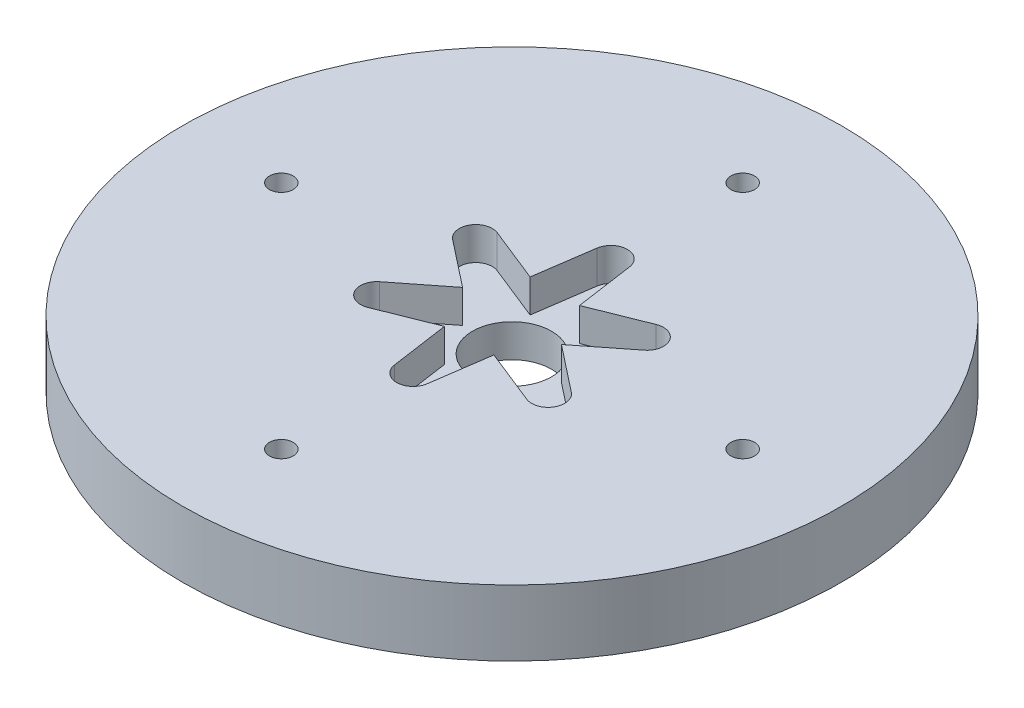
ISO-10303-21;
HEADER;
FILE_DESCRIPTION(('STEP AP214'),'2;1');
FILE_NAME('part.step','',(''),(''),'','','');
FILE_SCHEMA(('AUTOMOTIVE_DESIGN { 1 0 10303 214 1 1 1 1 }'));
ENDSEC;
DATA;
#1=APPLICATION_CONTEXT('core data for automotive mechanical design processes');
#2=APPLICATION_PROTOCOL_DEFINITION('international standard','automotive_design',2000,#1);
#3=PRODUCT_CONTEXT('',#1,'mechanical');
#4=PRODUCT('Part','Part','',(#3));
#5=PRODUCT_RELATED_PRODUCT_CATEGORY('part','',(#4));
#6=PRODUCT_DEFINITION_FORMATION('','',#4);
#7=PRODUCT_DEFINITION_CONTEXT('part definition',#1,'design');
#8=PRODUCT_DEFINITION('design','',#6,#7);
#9=PRODUCT_DEFINITION_SHAPE('','',#8);
#10=(LENGTH_UNIT() NAMED_UNIT(*) SI_UNIT(.MILLI.,.METRE.));
#11=(NAMED_UNIT(*) PLANE_ANGLE_UNIT() SI_UNIT($,.RADIAN.));
#12=(NAMED_UNIT(*) SI_UNIT($,.STERADIAN.) SOLID_ANGLE_UNIT());
#13=UNCERTAINTY_MEASURE_WITH_UNIT(LENGTH_MEASURE(1.E-05),#10,'distance_accuracy_value','');
#14=(GEOMETRIC_REPRESENTATION_CONTEXT(3) GLOBAL_UNCERTAINTY_ASSIGNED_CONTEXT((#13)) GLOBAL_UNIT_ASSIGNED_CONTEXT((#10,
#11,#12)) REPRESENTATION_CONTEXT('',''));
#15=CARTESIAN_POINT('',(0.,0.,0.));
#16=DIRECTION('',(0.,0.,1.));
#17=DIRECTION('',(1.,0.,0.));
#18=AXIS2_PLACEMENT_3D('',#15,#16,#17);
#19=CARTESIAN_POINT('',(0.,5.,0.));
#20=DIRECTION('',(0.,1.,0.));
#21=DIRECTION('',(0.,0.,1.));
#22=AXIS2_PLACEMENT_3D('',#19,#20,#21);
#23=PLANE('',#22);
#24=CARTESIAN_POINT('',(0.,5.,35.));
#25=DIRECTION('',(0.,1.,0.));
#26=DIRECTION('',(0.,0.,1.));
#27=AXIS2_PLACEMENT_3D('',#24,#25,#26);
#28=CIRCLE('',#27,1.8);
#29=CARTESIAN_POINT('',(0.,5.,36.8));
#30=VERTEX_POINT('',#29);
#31=EDGE_CURVE('E497',#30,#30,#28,.T.);
#32=ORIENTED_EDGE('',*,*,#31,.F.);
#33=EDGE_LOOP('',(#32));
#34=FACE_BOUND('',#33,.T.);
#35=CARTESIAN_POINT('',(0.,5.,-35.));
#36=DIRECTION('',(0.,1.,0.));
#37=DIRECTION('',(0.,0.,1.));
#38=AXIS2_PLACEMENT_3D('',#35,#36,#37);
#39=CIRCLE('',#38,1.8);
#40=CARTESIAN_POINT('',(0.,5.,-33.2));
#41=VERTEX_POINT('',#40);
#42=EDGE_CURVE('E240',#41,#41,#39,.T.);
#43=ORIENTED_EDGE('',*,*,#42,.F.);
#44=EDGE_LOOP('',(#43));
#45=FACE_BOUND('',#44,.T.);
#46=CARTESIAN_POINT('',(0.,5.,0.));
#47=DIRECTION('',(0.,1.,0.));
#48=DIRECTION('',(0.,0.,1.));
#49=AXIS2_PLACEMENT_3D('',#46,#47,#48);
#50=CIRCLE('',#49,50.);
#51=CARTESIAN_POINT('',(0.,5.,50.));
#52=VERTEX_POINT('',#51);
#53=EDGE_CURVE('E11',#52,#52,#50,.T.);
#54=ORIENTED_EDGE('',*,*,#53,.T.);
#55=EDGE_LOOP('',(#54));
#56=FACE_BOUND('',#55,.T.);
#57=DIRECTION('',(-0.928457391309651,0.,-0.371438921658026));
#58=VECTOR('',#57,1.);
#59=CARTESIAN_POINT('',(-12.0617837526215,5.,-9.82114347827412));
#60=LINE('',#59,#58);
#61=CARTESIAN_POINT('',(-3.75416512459886,5.,-6.49759526419164));
#62=VERTEX_POINT('',#61);
#63=CARTESIAN_POINT('',(-12.0617837526215,5.,-9.82114347827412));
#64=VERTEX_POINT('',#63);
#65=EDGE_CURVE('E352',#62,#64,#60,.T.);
#66=ORIENTED_EDGE('',*,*,#65,.F.);
#67=DIRECTION('',(-0.866025403784428,0.,0.500000000000019));
#68=VECTOR('',#67,1.);
#69=CARTESIAN_POINT('',(-3.75,5.,-6.5));
#70=LINE('',#69,#68);
#71=CARTESIAN_POINT('',(-3.75,5.,-6.5));
#72=VERTEX_POINT('',#71);
#73=EDGE_CURVE('E142',#72,#62,#70,.T.);
#74=ORIENTED_EDGE('',*,*,#73,.F.);
#75=DIRECTION('',(-0.142553153544677,0.,0.9897871480346));
#76=VECTOR('',#75,1.);
#77=CARTESIAN_POINT('',(-3.75,5.,-6.5));
#78=LINE('',#77,#76);
#79=CARTESIAN_POINT('',(-2.4744678700865,5.,-15.3563828838617));
#80=VERTEX_POINT('',#79);
#81=EDGE_CURVE('E59',#80,#72,#78,.T.);
#82=ORIENTED_EDGE('',*,*,#81,.F.);
#83=CARTESIAN_POINT('',(0.,5.,-15.));
#84=DIRECTION('',(0.,1.,0.));
#85=DIRECTION('',(0.,0.,1.));
#86=AXIS2_PLACEMENT_3D('',#83,#84,#85);
#87=CIRCLE('',#86,2.5);
#88=CARTESIAN_POINT('',(2.4744678700865,5.,-15.3563828838617));
#89=VERTEX_POINT('',#88);
#90=EDGE_CURVE('E229',#89,#80,#87,.T.);
#91=ORIENTED_EDGE('',*,*,#90,.F.);
#92=DIRECTION('',(-0.142553153544677,0.,-0.9897871480346));
#93=VECTOR('',#92,1.);
#94=CARTESIAN_POINT('',(2.4744678700865,5.,-15.3563828838617));
#95=LINE('',#94,#93);
#96=CARTESIAN_POINT('',(3.75,5.,-6.5));
#97=VERTEX_POINT('',#96);
#98=EDGE_CURVE('E215',#97,#89,#95,.T.);
#99=ORIENTED_EDGE('',*,*,#98,.F.);
#100=DIRECTION('',(-0.866025403784379,0.,-0.500000000000103));
#101=VECTOR('',#100,1.);
#102=CARTESIAN_POINT('',(3.75,5.,-6.5));
#103=LINE('',#102,#101);
#104=CARTESIAN_POINT('',(3.75416512459885,5.,-6.49759526419164));
#105=VERTEX_POINT('',#104);
#106=EDGE_CURVE('E205',#105,#97,#103,.T.);
#107=ORIENTED_EDGE('',*,*,#106,.F.);
#108=DIRECTION('',(-0.928457391309651,0.,0.371438921658027));
#109=VECTOR('',#108,1.);
#110=CARTESIAN_POINT('',(3.75416512459885,5.,-6.49759526419164));
#111=LINE('',#110,#109);
#112=CARTESIAN_POINT('',(12.0617837526215,5.,-9.82114347827413));
#113=VERTEX_POINT('',#112);
#114=EDGE_CURVE('E216',#113,#105,#111,.T.);
#115=ORIENTED_EDGE('',*,*,#114,.F.);
#116=CARTESIAN_POINT('',(12.9903810567666,5.,-7.50000000000001));
#117=DIRECTION('',(0.,1.,0.));
#118=DIRECTION('',(0.,0.,1.));
#119=AXIS2_PLACEMENT_3D('',#116,#117,#118);
#120=CIRCLE('',#119,2.5);
#121=CARTESIAN_POINT('',(14.536251622708,5.,-5.53523940558757));
#122=VERTEX_POINT('',#121);
#123=EDGE_CURVE('E390',#122,#113,#120,.T.);
#124=ORIENTED_EDGE('',*,*,#123,.F.);
#125=DIRECTION('',(0.785904237764974,0.,-0.618348226376574));
#126=VECTOR('',#125,1.);
#127=CARTESIAN_POINT('',(14.536251622708,5.,-5.53523940558757));
#128=LINE('',#127,#126);
#129=CARTESIAN_POINT('',(7.50416512459885,5.,-0.00240473580835621));
#130=VERTEX_POINT('',#129);
#131=EDGE_CURVE('E388',#130,#122,#128,.T.);
#132=ORIENTED_EDGE('',*,*,#131,.F.);
#133=DIRECTION('',(0.,0.,-1.));
#134=VECTOR('',#133,1.);
#135=CARTESIAN_POINT('',(7.50416512459885,5.,-0.00240473580835621));
#136=LINE('',#135,#134);
#137=CARTESIAN_POINT('',(7.50416512459885,5.,0.00240473580835274));
#138=VERTEX_POINT('',#137);
#139=EDGE_CURVE('E386',#138,#130,#136,.T.);
#140=ORIENTED_EDGE('',*,*,#139,.F.);
#141=DIRECTION('',(-0.785904237764975,0.,-0.618348226376574));
#142=VECTOR('',#141,1.);
#143=CARTESIAN_POINT('',(7.50416512459885,5.,0.00240473580835274));
#144=LINE('',#143,#142);
#145=CARTESIAN_POINT('',(14.536251622708,5.,5.53523940558756));
#146=VERTEX_POINT('',#145);
#147=EDGE_CURVE('E384',#146,#138,#144,.T.);
#148=ORIENTED_EDGE('',*,*,#147,.F.);
#149=CARTESIAN_POINT('',(12.9903810567666,5.,7.5));
#150=DIRECTION('',(0.,1.,0.));
#151=DIRECTION('',(0.,0.,1.));
#152=AXIS2_PLACEMENT_3D('',#149,#150,#151);
#153=CIRCLE('',#152,2.5);
#154=CARTESIAN_POINT('',(12.0617837526215,5.,9.82114347827412));
#155=VERTEX_POINT('',#154);
#156=EDGE_CURVE('E382',#155,#146,#153,.T.);
#157=ORIENTED_EDGE('',*,*,#156,.F.);
#158=DIRECTION('',(0.928457391309651,0.,0.371438921658026));
#159=VECTOR('',#158,1.);
#160=CARTESIAN_POINT('',(12.0617837526215,5.,9.82114347827412));
#161=LINE('',#160,#159);
#162=CARTESIAN_POINT('',(3.75416512459885,5.,6.49759526419164));
#163=VERTEX_POINT('',#162);
#164=EDGE_CURVE('E380',#163,#155,#161,.T.);
#165=ORIENTED_EDGE('',*,*,#164,.F.);
#166=DIRECTION('',(0.866025403784515,0.,-0.499999999999868));
#167=VECTOR('',#166,1.);
#168=CARTESIAN_POINT('',(3.75416512459885,5.,6.49759526419164));
#169=LINE('',#168,#167);
#170=CARTESIAN_POINT('',(3.75,5.,6.5));
#171=VERTEX_POINT('',#170);
#172=EDGE_CURVE('E378',#171,#163,#169,.T.);
#173=ORIENTED_EDGE('',*,*,#172,.F.);
#174=DIRECTION('',(0.142553153544677,0.,-0.9897871480346));
#175=VECTOR('',#174,1.);
#176=CARTESIAN_POINT('',(3.75,5.,6.5));
#177=LINE('',#176,#175);
#178=CARTESIAN_POINT('',(2.4744678700865,5.,15.3563828838617));
#179=VERTEX_POINT('',#178);
#180=EDGE_CURVE('E376',#179,#171,#177,.T.);
#181=ORIENTED_EDGE('',*,*,#180,.F.);
#182=CARTESIAN_POINT('',(0.,5.,15.));
#183=DIRECTION('',(0.,1.,0.));
#184=DIRECTION('',(0.,0.,1.));
#185=AXIS2_PLACEMENT_3D('',#182,#183,#184);
#186=CIRCLE('',#185,2.5);
#187=CARTESIAN_POINT('',(-2.4744678700865,5.,15.3563828838617));
#188=VERTEX_POINT('',#187);
#189=EDGE_CURVE('E374',#188,#179,#186,.T.);
#190=ORIENTED_EDGE('',*,*,#189,.F.);
#191=DIRECTION('',(0.142553153544677,0.,0.9897871480346));
#192=VECTOR('',#191,1.);
#193=CARTESIAN_POINT('',(-2.4744678700865,5.,15.3563828838617));
#194=LINE('',#193,#192);
#195=CARTESIAN_POINT('',(-3.75,5.,6.5));
#196=VERTEX_POINT('',#195);
#197=EDGE_CURVE('E372',#196,#188,#194,.T.);
#198=ORIENTED_EDGE('',*,*,#197,.F.);
#199=DIRECTION('',(0.86602540378449,0.,0.49999999999991));
#200=VECTOR('',#199,1.);
#201=CARTESIAN_POINT('',(-3.75,5.,6.5));
#202=LINE('',#201,#200);
#203=CARTESIAN_POINT('',(-3.75416512459885,5.,6.49759526419165));
#204=VERTEX_POINT('',#203);
#205=EDGE_CURVE('E370',#204,#196,#202,.T.);
#206=ORIENTED_EDGE('',*,*,#205,.F.);
#207=DIRECTION('',(0.928457391309651,0.,-0.371438921658027));
#208=VECTOR('',#207,1.);
#209=CARTESIAN_POINT('',(-3.75416512459885,5.,6.49759526419165));
#210=LINE('',#209,#208);
#211=CARTESIAN_POINT('',(-12.0617837526215,5.,9.82114347827413));
#212=VERTEX_POINT('',#211);
#213=EDGE_CURVE('E368',#212,#204,#210,.T.);
#214=ORIENTED_EDGE('',*,*,#213,.F.);
#215=CARTESIAN_POINT('',(-12.9903810567666,5.,7.50000000000001));
#216=DIRECTION('',(0.,1.,0.));
#217=DIRECTION('',(0.,0.,1.));
#218=AXIS2_PLACEMENT_3D('',#215,#216,#217);
#219=CIRCLE('',#218,2.5);
#220=CARTESIAN_POINT('',(-14.536251622708,5.,5.53523940558757));
#221=VERTEX_POINT('',#220);
#222=EDGE_CURVE('E366',#221,#212,#219,.T.);
#223=ORIENTED_EDGE('',*,*,#222,.F.);
#224=DIRECTION('',(-0.785904237764974,0.,0.618348226376574));
#225=VECTOR('',#224,1.);
#226=CARTESIAN_POINT('',(-14.536251622708,5.,5.53523940558757));
#227=LINE('',#226,#225);
#228=CARTESIAN_POINT('',(-7.50416512459885,5.,0.00240473580835794));
#229=VERTEX_POINT('',#228);
#230=EDGE_CURVE('E364',#229,#221,#227,.T.);
#231=ORIENTED_EDGE('',*,*,#230,.F.);
#232=DIRECTION('',(0.,0.,1.));
#233=VECTOR('',#232,1.);
#234=CARTESIAN_POINT('',(-7.50416512459885,5.,-0.00240473580834927));
#235=LINE('',#234,#233);
#236=CARTESIAN_POINT('',(-7.50416512459885,5.,-0.00240473580834927));
#237=VERTEX_POINT('',#236);
#238=EDGE_CURVE('E362',#237,#229,#235,.T.);
#239=ORIENTED_EDGE('',*,*,#238,.F.);
#240=DIRECTION('',(0.785904237764975,0.,0.618348226376573));
#241=VECTOR('',#240,1.);
#242=CARTESIAN_POINT('',(-7.50416512459885,5.,-0.00240473580834927));
#243=LINE('',#242,#241);
#244=CARTESIAN_POINT('',(-14.536251622708,5.,-5.53523940558755));
#245=VERTEX_POINT('',#244);
#246=EDGE_CURVE('E360',#245,#237,#243,.T.);
#247=ORIENTED_EDGE('',*,*,#246,.F.);
#248=CARTESIAN_POINT('',(-12.9903810567666,5.,-7.49999999999999));
#249=DIRECTION('',(0.,1.,0.));
#250=DIRECTION('',(0.,0.,1.));
#251=AXIS2_PLACEMENT_3D('',#248,#249,#250);
#252=CIRCLE('',#251,2.5);
#253=EDGE_CURVE('E354',#64,#245,#252,.T.);
#254=ORIENTED_EDGE('',*,*,#253,.F.);
#255=EDGE_LOOP('',(#66,#74,#82,#91,#99,#107,#115,#124,#132,#140,#148,#157,#165,#173,#181,#190,
#198,#206,#214,#223,#231,#239,#247,#254));
#256=FACE_BOUND('',#255,.T.);
#257=CARTESIAN_POINT('',(35.,5.,0.));
#258=DIRECTION('',(0.,1.,0.));
#259=DIRECTION('',(0.,0.,1.));
#260=AXIS2_PLACEMENT_3D('',#257,#258,#259);
#261=CIRCLE('',#260,1.79999999999999);
#262=CARTESIAN_POINT('',(35.,5.,1.79999999999999));
#263=VERTEX_POINT('',#262);
#264=EDGE_CURVE('E517',#263,#263,#261,.T.);
#265=ORIENTED_EDGE('',*,*,#264,.F.);
#266=EDGE_LOOP('',(#265));
#267=FACE_BOUND('',#266,.T.);
#268=CARTESIAN_POINT('',(-35.,5.,0.));
#269=DIRECTION('',(0.,1.,0.));
#270=DIRECTION('',(0.,0.,1.));
#271=AXIS2_PLACEMENT_3D('',#268,#269,#270);
#272=CIRCLE('',#271,1.8);
#273=CARTESIAN_POINT('',(-35.,5.,1.80000000000001));
#274=VERTEX_POINT('',#273);
#275=EDGE_CURVE('E507',#274,#274,#272,.T.);
#276=ORIENTED_EDGE('',*,*,#275,.F.);
#277=EDGE_LOOP('',(#276));
#278=FACE_BOUND('',#277,.T.);
#279=ADVANCED_FACE('F38',(#34,#45,#56,#256,#267,#278),#23,.T.);
#280=CARTESIAN_POINT('',(0.,5.,0.));
#281=DIRECTION('',(0.,-1.,0.));
#282=DIRECTION('',(0.,0.,-1.));
#283=AXIS2_PLACEMENT_3D('',#280,#281,#282);
#284=CYLINDRICAL_SURFACE('',#283,50.);
#285=ORIENTED_EDGE('',*,*,#53,.F.);
#286=EDGE_LOOP('',(#285));
#287=FACE_BOUND('',#286,.T.);
#288=CARTESIAN_POINT('',(0.,-5.,0.));
#289=DIRECTION('',(0.,-1.,0.));
#290=DIRECTION('',(0.,0.,-1.));
#291=AXIS2_PLACEMENT_3D('',#288,#289,#290);
#292=CIRCLE('',#291,50.);
#293=CARTESIAN_POINT('',(0.,-5.,-50.));
#294=VERTEX_POINT('',#293);
#295=EDGE_CURVE('E505',#294,#294,#292,.T.);
#296=ORIENTED_EDGE('',*,*,#295,.F.);
#297=EDGE_LOOP('',(#296));
#298=FACE_BOUND('',#297,.T.);
#299=ADVANCED_FACE('F40',(#287,#298),#284,.T.);
#300=CARTESIAN_POINT('',(-3.75,5.,-6.5));
#301=DIRECTION('',(0.500000000000019,0.,0.866025403784428));
#302=DIRECTION('',(0.866025403784428,0.,-0.500000000000019));
#303=AXIS2_PLACEMENT_3D('',#300,#301,#302);
#304=PLANE('',#303);
#305=DIRECTION('',(-0.866025403784428,0.,0.500000000000019));
#306=VECTOR('',#305,1.);
#307=CARTESIAN_POINT('',(-3.75,0.,-6.5));
#308=LINE('',#307,#306);
#309=CARTESIAN_POINT('',(-3.75,0.,-6.5));
#310=VERTEX_POINT('',#309);
#311=CARTESIAN_POINT('',(-3.75416512459886,0.,-6.49759526419164));
#312=VERTEX_POINT('',#311);
#313=EDGE_CURVE('E236',#310,#312,#308,.T.);
#314=ORIENTED_EDGE('',*,*,#313,.F.);
#315=DIRECTION('',(0.,-1.,0.));
#316=VECTOR('',#315,1.);
#317=CARTESIAN_POINT('',(-3.75,5.,-6.5));
#318=LINE('',#317,#316);
#319=EDGE_CURVE('E235',#72,#310,#318,.T.);
#320=ORIENTED_EDGE('',*,*,#319,.F.);
#321=ORIENTED_EDGE('',*,*,#73,.T.);
#322=DIRECTION('',(0.,-1.,0.));
#323=VECTOR('',#322,1.);
#324=CARTESIAN_POINT('',(-3.75416512459886,5.,-6.49759526419164));
#325=LINE('',#324,#323);
#326=EDGE_CURVE('E46',#62,#312,#325,.T.);
#327=ORIENTED_EDGE('',*,*,#326,.T.);
#328=EDGE_LOOP('',(#314,#320,#321,#327));
#329=FACE_BOUND('',#328,.T.);
#330=ADVANCED_FACE('F346',(#329),#304,.T.);
#331=CARTESIAN_POINT('',(-12.0617837526215,5.,-9.82114347827412));
#332=DIRECTION('',(-0.371438921658026,0.,0.928457391309651));
#333=DIRECTION('',(0.928457391309651,0.,0.371438921658026));
#334=AXIS2_PLACEMENT_3D('',#331,#332,#333);
#335=PLANE('',#334);
#336=DIRECTION('',(-0.928457391309651,0.,-0.371438921658026));
#337=VECTOR('',#336,1.);
#338=CARTESIAN_POINT('',(-12.0617837526215,0.,-9.82114347827412));
#339=LINE('',#338,#337);
#340=CARTESIAN_POINT('',(-12.0617837526215,0.,-9.82114347827412));
#341=VERTEX_POINT('',#340);
#342=EDGE_CURVE('E239',#312,#341,#339,.T.);
#343=ORIENTED_EDGE('',*,*,#342,.F.);
#344=ORIENTED_EDGE('',*,*,#326,.F.);
#345=ORIENTED_EDGE('',*,*,#65,.T.);
#346=DIRECTION('',(0.,-1.,0.));
#347=VECTOR('',#346,1.);
#348=CARTESIAN_POINT('',(-12.0617837526215,5.,-9.82114347827412));
#349=LINE('',#348,#347);
#350=EDGE_CURVE('E344',#64,#341,#349,.T.);
#351=ORIENTED_EDGE('',*,*,#350,.T.);
#352=EDGE_LOOP('',(#343,#344,#345,#351));
#353=FACE_BOUND('',#352,.T.);
#354=ADVANCED_FACE('F479',(#353),#335,.T.);
#355=CARTESIAN_POINT('',(-12.9903810567666,5.,-7.49999999999999));
#356=DIRECTION('',(0.,-1.,0.));
#357=DIRECTION('',(0.,0.,-1.));
#358=AXIS2_PLACEMENT_3D('',#355,#356,#357);
#359=CYLINDRICAL_SURFACE('',#358,2.5);
#360=CARTESIAN_POINT('',(-12.9903810567666,0.,-7.49999999999999));
#361=DIRECTION('',(0.,1.,0.));
#362=DIRECTION('',(0.,0.,1.));
#363=AXIS2_PLACEMENT_3D('',#360,#361,#362);
#364=CIRCLE('',#363,2.5);
#365=CARTESIAN_POINT('',(-14.536251622708,0.,-5.53523940558755));
#366=VERTEX_POINT('',#365);
#367=EDGE_CURVE('E243',#341,#366,#364,.T.);
#368=ORIENTED_EDGE('',*,*,#367,.F.);
#369=ORIENTED_EDGE('',*,*,#350,.F.);
#370=ORIENTED_EDGE('',*,*,#253,.T.);
#371=DIRECTION('',(0.,-1.,0.));
#372=VECTOR('',#371,1.);
#373=CARTESIAN_POINT('',(-14.536251622708,5.,-5.53523940558755));
#374=LINE('',#373,#372);
#375=EDGE_CURVE('E342',#245,#366,#374,.T.);
#376=ORIENTED_EDGE('',*,*,#375,.T.);
#377=EDGE_LOOP('',(#368,#369,#370,#376));
#378=FACE_BOUND('',#377,.T.);
#379=ADVANCED_FACE('F477',(#378),#359,.F.);
#380=CARTESIAN_POINT('',(-7.50416512459885,5.,-0.00240473580834927));
#381=DIRECTION('',(0.618348226376573,0.,-0.785904237764975));
#382=DIRECTION('',(-0.785904237764975,0.,-0.618348226376573));
#383=AXIS2_PLACEMENT_3D('',#380,#381,#382);
#384=PLANE('',#383);
#385=DIRECTION('',(0.785904237764975,0.,0.618348226376573));
#386=VECTOR('',#385,1.);
#387=CARTESIAN_POINT('',(-7.50416512459885,0.,-0.00240473580834927));
#388=LINE('',#387,#386);
#389=CARTESIAN_POINT('',(-7.50416512459885,0.,-0.00240473580834927));
#390=VERTEX_POINT('',#389);
#391=EDGE_CURVE('E246',#366,#390,#388,.T.);
#392=ORIENTED_EDGE('',*,*,#391,.F.);
#393=ORIENTED_EDGE('',*,*,#375,.F.);
#394=ORIENTED_EDGE('',*,*,#246,.T.);
#395=DIRECTION('',(0.,-1.,0.));
#396=VECTOR('',#395,1.);
#397=CARTESIAN_POINT('',(-7.50416512459885,5.,-0.00240473580834927));
#398=LINE('',#397,#396);
#399=EDGE_CURVE('E340',#237,#390,#398,.T.);
#400=ORIENTED_EDGE('',*,*,#399,.T.);
#401=EDGE_LOOP('',(#392,#393,#394,#400));
#402=FACE_BOUND('',#401,.T.);
#403=ADVANCED_FACE('F474',(#402),#384,.T.);
#404=CARTESIAN_POINT('',(-7.50416512459885,5.,-0.00240473580834927));
#405=DIRECTION('',(1.,0.,0.));
#406=DIRECTION('',(0.,0.,-1.));
#407=AXIS2_PLACEMENT_3D('',#404,#405,#406);
#408=PLANE('',#407);
#409=DIRECTION('',(0.,0.,1.));
#410=VECTOR('',#409,1.);
#411=CARTESIAN_POINT('',(-7.50416512459885,0.,-0.00240473580834927));
#412=LINE('',#411,#410);
#413=CARTESIAN_POINT('',(-7.50416512459885,0.,0.00240473580835794));
#414=VERTEX_POINT('',#413);
#415=EDGE_CURVE('E249',#390,#414,#412,.T.);
#416=ORIENTED_EDGE('',*,*,#415,.F.);
#417=ORIENTED_EDGE('',*,*,#399,.F.);
#418=ORIENTED_EDGE('',*,*,#238,.T.);
#419=DIRECTION('',(0.,-1.,0.));
#420=VECTOR('',#419,1.);
#421=CARTESIAN_POINT('',(-7.50416512459885,5.,0.00240473580835794));
#422=LINE('',#421,#420);
#423=EDGE_CURVE('E338',#229,#414,#422,.T.);
#424=ORIENTED_EDGE('',*,*,#423,.T.);
#425=EDGE_LOOP('',(#416,#417,#418,#424));
#426=FACE_BOUND('',#425,.T.);
#427=ADVANCED_FACE('F468',(#426),#408,.T.);
#428=CARTESIAN_POINT('',(-14.536251622708,5.,5.53523940558757));
#429=DIRECTION('',(0.618348226376574,0.,0.785904237764974));
#430=DIRECTION('',(0.785904237764974,0.,-0.618348226376574));
#431=AXIS2_PLACEMENT_3D('',#428,#429,#430);
#432=PLANE('',#431);
#433=DIRECTION('',(-0.785904237764974,0.,0.618348226376574));
#434=VECTOR('',#433,1.);
#435=CARTESIAN_POINT('',(-14.536251622708,0.,5.53523940558757));
#436=LINE('',#435,#434);
#437=CARTESIAN_POINT('',(-14.536251622708,0.,5.53523940558757));
#438=VERTEX_POINT('',#437);
#439=EDGE_CURVE('E252',#414,#438,#436,.T.);
#440=ORIENTED_EDGE('',*,*,#439,.F.);
#441=ORIENTED_EDGE('',*,*,#423,.F.);
#442=ORIENTED_EDGE('',*,*,#230,.T.);
#443=DIRECTION('',(0.,-1.,0.));
#444=VECTOR('',#443,1.);
#445=CARTESIAN_POINT('',(-14.536251622708,5.,5.53523940558757));
#446=LINE('',#445,#444);
#447=EDGE_CURVE('E336',#221,#438,#446,.T.);
#448=ORIENTED_EDGE('',*,*,#447,.T.);
#449=EDGE_LOOP('',(#440,#441,#442,#448));
#450=FACE_BOUND('',#449,.T.);
#451=ADVANCED_FACE('F464',(#450),#432,.T.);
#452=CARTESIAN_POINT('',(-12.9903810567666,5.,7.50000000000001));
#453=DIRECTION('',(0.,-1.,0.));
#454=DIRECTION('',(0.,0.,-1.));
#455=AXIS2_PLACEMENT_3D('',#452,#453,#454);
#456=CYLINDRICAL_SURFACE('',#455,2.5);
#457=CARTESIAN_POINT('',(-12.9903810567666,0.,7.50000000000001));
#458=DIRECTION('',(0.,1.,0.));
#459=DIRECTION('',(0.,0.,1.));
#460=AXIS2_PLACEMENT_3D('',#457,#458,#459);
#461=CIRCLE('',#460,2.5);
#462=CARTESIAN_POINT('',(-12.0617837526215,0.,9.82114347827413));
#463=VERTEX_POINT('',#462);
#464=EDGE_CURVE('E255',#438,#463,#461,.T.);
#465=ORIENTED_EDGE('',*,*,#464,.F.);
#466=ORIENTED_EDGE('',*,*,#447,.F.);
#467=ORIENTED_EDGE('',*,*,#222,.T.);
#468=DIRECTION('',(0.,-1.,0.));
#469=VECTOR('',#468,1.);
#470=CARTESIAN_POINT('',(-12.0617837526215,5.,9.82114347827413));
#471=LINE('',#470,#469);
#472=EDGE_CURVE('E334',#212,#463,#471,.T.);
#473=ORIENTED_EDGE('',*,*,#472,.T.);
#474=EDGE_LOOP('',(#465,#466,#467,#473));
#475=FACE_BOUND('',#474,.T.);
#476=ADVANCED_FACE('F461',(#475),#456,.F.);
#477=CARTESIAN_POINT('',(-3.75416512459885,5.,6.49759526419165));
#478=DIRECTION('',(-0.371438921658027,0.,-0.928457391309651));
#479=DIRECTION('',(-0.928457391309651,0.,0.371438921658027));
#480=AXIS2_PLACEMENT_3D('',#477,#478,#479);
#481=PLANE('',#480);
#482=DIRECTION('',(0.928457391309651,0.,-0.371438921658027));
#483=VECTOR('',#482,1.);
#484=CARTESIAN_POINT('',(-3.75416512459885,0.,6.49759526419165));
#485=LINE('',#484,#483);
#486=CARTESIAN_POINT('',(-3.75416512459885,0.,6.49759526419165));
#487=VERTEX_POINT('',#486);
#488=EDGE_CURVE('E258',#463,#487,#485,.T.);
#489=ORIENTED_EDGE('',*,*,#488,.F.);
#490=ORIENTED_EDGE('',*,*,#472,.F.);
#491=ORIENTED_EDGE('',*,*,#213,.T.);
#492=DIRECTION('',(0.,-1.,0.));
#493=VECTOR('',#492,1.);
#494=CARTESIAN_POINT('',(-3.75416512459885,5.,6.49759526419165));
#495=LINE('',#494,#493);
#496=EDGE_CURVE('E332',#204,#487,#495,.T.);
#497=ORIENTED_EDGE('',*,*,#496,.T.);
#498=EDGE_LOOP('',(#489,#490,#491,#497));
#499=FACE_BOUND('',#498,.T.);
#500=ADVANCED_FACE('F453',(#499),#481,.T.);
#501=CARTESIAN_POINT('',(-3.75,5.,6.5));
#502=DIRECTION('',(0.49999999999991,0.,-0.866025403784491));
#503=DIRECTION('',(-0.866025403784491,0.,-0.49999999999991));
#504=AXIS2_PLACEMENT_3D('',#501,#502,#503);
#505=PLANE('',#504);
#506=DIRECTION('',(0.86602540378449,0.,0.49999999999991));
#507=VECTOR('',#506,1.);
#508=CARTESIAN_POINT('',(-3.75,0.,6.5));
#509=LINE('',#508,#507);
#510=CARTESIAN_POINT('',(-3.75,0.,6.5));
#511=VERTEX_POINT('',#510);
#512=EDGE_CURVE('E261',#487,#511,#509,.T.);
#513=ORIENTED_EDGE('',*,*,#512,.F.);
#514=ORIENTED_EDGE('',*,*,#496,.F.);
#515=ORIENTED_EDGE('',*,*,#205,.T.);
#516=DIRECTION('',(0.,-1.,0.));
#517=VECTOR('',#516,1.);
#518=CARTESIAN_POINT('',(-3.75,5.,6.5));
#519=LINE('',#518,#517);
#520=EDGE_CURVE('E330',#196,#511,#519,.T.);
#521=ORIENTED_EDGE('',*,*,#520,.T.);
#522=EDGE_LOOP('',(#513,#514,#515,#521));
#523=FACE_BOUND('',#522,.T.);
#524=ADVANCED_FACE('F449',(#523),#505,.T.);
#525=CARTESIAN_POINT('',(-2.4744678700865,5.,15.3563828838617));
#526=DIRECTION('',(0.9897871480346,0.,-0.142553153544677));
#527=DIRECTION('',(-0.142553153544677,0.,-0.9897871480346));
#528=AXIS2_PLACEMENT_3D('',#525,#526,#527);
#529=PLANE('',#528);
#530=DIRECTION('',(0.142553153544677,0.,0.9897871480346));
#531=VECTOR('',#530,1.);
#532=CARTESIAN_POINT('',(-2.4744678700865,0.,15.3563828838617));
#533=LINE('',#532,#531);
#534=CARTESIAN_POINT('',(-2.4744678700865,0.,15.3563828838617));
#535=VERTEX_POINT('',#534);
#536=EDGE_CURVE('E264',#511,#535,#533,.T.);
#537=ORIENTED_EDGE('',*,*,#536,.F.);
#538=ORIENTED_EDGE('',*,*,#520,.F.);
#539=ORIENTED_EDGE('',*,*,#197,.T.);
#540=DIRECTION('',(0.,-1.,0.));
#541=VECTOR('',#540,1.);
#542=CARTESIAN_POINT('',(-2.4744678700865,5.,15.3563828838617));
#543=LINE('',#542,#541);
#544=EDGE_CURVE('E328',#188,#535,#543,.T.);
#545=ORIENTED_EDGE('',*,*,#544,.T.);
#546=EDGE_LOOP('',(#537,#538,#539,#545));
#547=FACE_BOUND('',#546,.T.);
#548=ADVANCED_FACE('F446',(#547),#529,.T.);
#549=CARTESIAN_POINT('',(0.,5.,15.));
#550=DIRECTION('',(0.,-1.,0.));
#551=DIRECTION('',(0.,0.,-1.));
#552=AXIS2_PLACEMENT_3D('',#549,#550,#551);
#553=CYLINDRICAL_SURFACE('',#552,2.5);
#554=CARTESIAN_POINT('',(0.,0.,15.));
#555=DIRECTION('',(0.,1.,0.));
#556=DIRECTION('',(0.,0.,1.));
#557=AXIS2_PLACEMENT_3D('',#554,#555,#556);
#558=CIRCLE('',#557,2.5);
#559=CARTESIAN_POINT('',(2.4744678700865,0.,15.3563828838617));
#560=VERTEX_POINT('',#559);
#561=EDGE_CURVE('E267',#535,#560,#558,.T.);
#562=ORIENTED_EDGE('',*,*,#561,.F.);
#563=ORIENTED_EDGE('',*,*,#544,.F.);
#564=ORIENTED_EDGE('',*,*,#189,.T.);
#565=DIRECTION('',(0.,-1.,0.));
#566=VECTOR('',#565,1.);
#567=CARTESIAN_POINT('',(2.4744678700865,5.,15.3563828838617));
#568=LINE('',#567,#566);
#569=EDGE_CURVE('E326',#179,#560,#568,.T.);
#570=ORIENTED_EDGE('',*,*,#569,.T.);
#571=EDGE_LOOP('',(#562,#563,#564,#570));
#572=FACE_BOUND('',#571,.T.);
#573=ADVANCED_FACE('F438',(#572),#553,.F.);
#574=CARTESIAN_POINT('',(3.75,5.,6.5));
#575=DIRECTION('',(-0.9897871480346,0.,-0.142553153544677));
#576=DIRECTION('',(-0.142553153544677,0.,0.9897871480346));
#577=AXIS2_PLACEMENT_3D('',#574,#575,#576);
#578=PLANE('',#577);
#579=DIRECTION('',(0.142553153544677,0.,-0.9897871480346));
#580=VECTOR('',#579,1.);
#581=CARTESIAN_POINT('',(3.75,0.,6.5));
#582=LINE('',#581,#580);
#583=CARTESIAN_POINT('',(3.75,0.,6.5));
#584=VERTEX_POINT('',#583);
#585=EDGE_CURVE('E270',#560,#584,#582,.T.);
#586=ORIENTED_EDGE('',*,*,#585,.F.);
#587=ORIENTED_EDGE('',*,*,#569,.F.);
#588=ORIENTED_EDGE('',*,*,#180,.T.);
#589=DIRECTION('',(0.,-1.,0.));
#590=VECTOR('',#589,1.);
#591=CARTESIAN_POINT('',(3.75,5.,6.5));
#592=LINE('',#591,#590);
#593=EDGE_CURVE('E324',#171,#584,#592,.T.);
#594=ORIENTED_EDGE('',*,*,#593,.T.);
#595=EDGE_LOOP('',(#586,#587,#588,#594));
#596=FACE_BOUND('',#595,.T.);
#597=ADVANCED_FACE('F434',(#596),#578,.T.);
#598=CARTESIAN_POINT('',(3.75416512459885,5.,6.49759526419164));
#599=DIRECTION('',(-0.499999999999868,0.,-0.866025403784515));
#600=DIRECTION('',(-0.866025403784515,0.,0.499999999999868));
#601=AXIS2_PLACEMENT_3D('',#598,#599,#600);
#602=PLANE('',#601);
#603=DIRECTION('',(0.866025403784515,0.,-0.499999999999868));
#604=VECTOR('',#603,1.);
#605=CARTESIAN_POINT('',(3.75416512459885,0.,6.49759526419164));
#606=LINE('',#605,#604);
#607=CARTESIAN_POINT('',(3.75416512459885,0.,6.49759526419164));
#608=VERTEX_POINT('',#607);
#609=EDGE_CURVE('E273',#584,#608,#606,.T.);
#610=ORIENTED_EDGE('',*,*,#609,.F.);
#611=ORIENTED_EDGE('',*,*,#593,.F.);
#612=ORIENTED_EDGE('',*,*,#172,.T.);
#613=DIRECTION('',(0.,-1.,0.));
#614=VECTOR('',#613,1.);
#615=CARTESIAN_POINT('',(3.75416512459885,5.,6.49759526419164));
#616=LINE('',#615,#614);
#617=EDGE_CURVE('E322',#163,#608,#616,.T.);
#618=ORIENTED_EDGE('',*,*,#617,.T.);
#619=EDGE_LOOP('',(#610,#611,#612,#618));
#620=FACE_BOUND('',#619,.T.);
#621=ADVANCED_FACE('F431',(#620),#602,.T.);
#622=CARTESIAN_POINT('',(12.0617837526215,5.,9.82114347827412));
#623=DIRECTION('',(0.371438921658026,0.,-0.928457391309651));
#624=DIRECTION('',(-0.928457391309651,0.,-0.371438921658026));
#625=AXIS2_PLACEMENT_3D('',#622,#623,#624);
#626=PLANE('',#625);
#627=DIRECTION('',(0.928457391309651,0.,0.371438921658026));
#628=VECTOR('',#627,1.);
#629=CARTESIAN_POINT('',(12.0617837526215,0.,9.82114347827412));
#630=LINE('',#629,#628);
#631=CARTESIAN_POINT('',(12.0617837526215,0.,9.82114347827412));
#632=VERTEX_POINT('',#631);
#633=EDGE_CURVE('E276',#608,#632,#630,.T.);
#634=ORIENTED_EDGE('',*,*,#633,.F.);
#635=ORIENTED_EDGE('',*,*,#617,.F.);
#636=ORIENTED_EDGE('',*,*,#164,.T.);
#637=DIRECTION('',(0.,-1.,0.));
#638=VECTOR('',#637,1.);
#639=CARTESIAN_POINT('',(12.0617837526215,5.,9.82114347827412));
#640=LINE('',#639,#638);
#641=EDGE_CURVE('E320',#155,#632,#640,.T.);
#642=ORIENTED_EDGE('',*,*,#641,.T.);
#643=EDGE_LOOP('',(#634,#635,#636,#642));
#644=FACE_BOUND('',#643,.T.);
#645=ADVANCED_FACE('F423',(#644),#626,.T.);
#646=CARTESIAN_POINT('',(12.9903810567666,5.,7.5));
#647=DIRECTION('',(0.,-1.,0.));
#648=DIRECTION('',(0.,0.,-1.));
#649=AXIS2_PLACEMENT_3D('',#646,#647,#648);
#650=CYLINDRICAL_SURFACE('',#649,2.5);
#651=CARTESIAN_POINT('',(12.9903810567666,0.,7.5));
#652=DIRECTION('',(0.,1.,0.));
#653=DIRECTION('',(0.,0.,1.));
#654=AXIS2_PLACEMENT_3D('',#651,#652,#653);
#655=CIRCLE('',#654,2.5);
#656=CARTESIAN_POINT('',(14.536251622708,0.,5.53523940558756));
#657=VERTEX_POINT('',#656);
#658=EDGE_CURVE('E279',#632,#657,#655,.T.);
#659=ORIENTED_EDGE('',*,*,#658,.F.);
#660=ORIENTED_EDGE('',*,*,#641,.F.);
#661=ORIENTED_EDGE('',*,*,#156,.T.);
#662=DIRECTION('',(0.,-1.,0.));
#663=VECTOR('',#662,1.);
#664=CARTESIAN_POINT('',(14.536251622708,5.,5.53523940558756));
#665=LINE('',#664,#663);
#666=EDGE_CURVE('E318',#146,#657,#665,.T.);
#667=ORIENTED_EDGE('',*,*,#666,.T.);
#668=EDGE_LOOP('',(#659,#660,#661,#667));
#669=FACE_BOUND('',#668,.T.);
#670=ADVANCED_FACE('F419',(#669),#650,.F.);
#671=CARTESIAN_POINT('',(7.50416512459885,5.,0.00240473580835274));
#672=DIRECTION('',(-0.618348226376574,0.,0.785904237764975));
#673=DIRECTION('',(0.785904237764975,0.,0.618348226376574));
#674=AXIS2_PLACEMENT_3D('',#671,#672,#673);
#675=PLANE('',#674);
#676=DIRECTION('',(-0.785904237764975,0.,-0.618348226376574));
#677=VECTOR('',#676,1.);
#678=CARTESIAN_POINT('',(7.50416512459885,0.,0.00240473580835274));
#679=LINE('',#678,#677);
#680=CARTESIAN_POINT('',(7.50416512459885,0.,0.00240473580835274));
#681=VERTEX_POINT('',#680);
#682=EDGE_CURVE('E282',#657,#681,#679,.T.);
#683=ORIENTED_EDGE('',*,*,#682,.F.);
#684=ORIENTED_EDGE('',*,*,#666,.F.);
#685=ORIENTED_EDGE('',*,*,#147,.T.);
#686=DIRECTION('',(0.,-1.,0.));
#687=VECTOR('',#686,1.);
#688=CARTESIAN_POINT('',(7.50416512459885,5.,0.00240473580835274));
#689=LINE('',#688,#687);
#690=EDGE_CURVE('E316',#138,#681,#689,.T.);
#691=ORIENTED_EDGE('',*,*,#690,.T.);
#692=EDGE_LOOP('',(#683,#684,#685,#691));
#693=FACE_BOUND('',#692,.T.);
#694=ADVANCED_FACE('F416',(#693),#675,.T.);
#695=CARTESIAN_POINT('',(7.50416512459885,5.,-0.00240473580835621));
#696=DIRECTION('',(-1.,0.,0.));
#697=DIRECTION('',(0.,0.,1.));
#698=AXIS2_PLACEMENT_3D('',#695,#696,#697);
#699=PLANE('',#698);
#700=DIRECTION('',(0.,0.,-1.));
#701=VECTOR('',#700,1.);
#702=CARTESIAN_POINT('',(7.50416512459885,0.,-0.00240473580835621));
#703=LINE('',#702,#701);
#704=CARTESIAN_POINT('',(7.50416512459885,0.,-0.00240473580835621));
#705=VERTEX_POINT('',#704);
#706=EDGE_CURVE('E285',#681,#705,#703,.T.);
#707=ORIENTED_EDGE('',*,*,#706,.F.);
#708=ORIENTED_EDGE('',*,*,#690,.F.);
#709=ORIENTED_EDGE('',*,*,#139,.T.);
#710=DIRECTION('',(0.,-1.,0.));
#711=VECTOR('',#710,1.);
#712=CARTESIAN_POINT('',(7.50416512459885,5.,-0.00240473580835621));
#713=LINE('',#712,#711);
#714=EDGE_CURVE('E314',#130,#705,#713,.T.);
#715=ORIENTED_EDGE('',*,*,#714,.T.);
#716=EDGE_LOOP('',(#707,#708,#709,#715));
#717=FACE_BOUND('',#716,.T.);
#718=ADVANCED_FACE('F408',(#717),#699,.T.);
#719=CARTESIAN_POINT('',(14.536251622708,5.,-5.53523940558757));
#720=DIRECTION('',(-0.618348226376574,0.,-0.785904237764974));
#721=DIRECTION('',(-0.785904237764974,0.,0.618348226376574));
#722=AXIS2_PLACEMENT_3D('',#719,#720,#721);
#723=PLANE('',#722);
#724=DIRECTION('',(0.785904237764974,0.,-0.618348226376574));
#725=VECTOR('',#724,1.);
#726=CARTESIAN_POINT('',(14.536251622708,0.,-5.53523940558757));
#727=LINE('',#726,#725);
#728=CARTESIAN_POINT('',(14.536251622708,0.,-5.53523940558757));
#729=VERTEX_POINT('',#728);
#730=EDGE_CURVE('E288',#705,#729,#727,.T.);
#731=ORIENTED_EDGE('',*,*,#730,.F.);
#732=ORIENTED_EDGE('',*,*,#714,.F.);
#733=ORIENTED_EDGE('',*,*,#131,.T.);
#734=DIRECTION('',(0.,-1.,0.));
#735=VECTOR('',#734,1.);
#736=CARTESIAN_POINT('',(14.536251622708,5.,-5.53523940558757));
#737=LINE('',#736,#735);
#738=EDGE_CURVE('E312',#122,#729,#737,.T.);
#739=ORIENTED_EDGE('',*,*,#738,.T.);
#740=EDGE_LOOP('',(#731,#732,#733,#739));
#741=FACE_BOUND('',#740,.T.);
#742=ADVANCED_FACE('F404',(#741),#723,.T.);
#743=CARTESIAN_POINT('',(12.9903810567666,5.,-7.50000000000001));
#744=DIRECTION('',(0.,-1.,0.));
#745=DIRECTION('',(0.,0.,-1.));
#746=AXIS2_PLACEMENT_3D('',#743,#744,#745);
#747=CYLINDRICAL_SURFACE('',#746,2.5);
#748=CARTESIAN_POINT('',(12.9903810567666,0.,-7.50000000000001));
#749=DIRECTION('',(0.,1.,0.));
#750=DIRECTION('',(0.,0.,1.));
#751=AXIS2_PLACEMENT_3D('',#748,#749,#750);
#752=CIRCLE('',#751,2.5);
#753=CARTESIAN_POINT('',(12.0617837526215,0.,-9.82114347827413));
#754=VERTEX_POINT('',#753);
#755=EDGE_CURVE('E291',#729,#754,#752,.T.);
#756=ORIENTED_EDGE('',*,*,#755,.F.);
#757=ORIENTED_EDGE('',*,*,#738,.F.);
#758=ORIENTED_EDGE('',*,*,#123,.T.);
#759=DIRECTION('',(0.,-1.,0.));
#760=VECTOR('',#759,1.);
#761=CARTESIAN_POINT('',(12.0617837526215,5.,-9.82114347827413));
#762=LINE('',#761,#760);
#763=EDGE_CURVE('E310',#113,#754,#762,.T.);
#764=ORIENTED_EDGE('',*,*,#763,.T.);
#765=EDGE_LOOP('',(#756,#757,#758,#764));
#766=FACE_BOUND('',#765,.T.);
#767=ADVANCED_FACE('F401',(#766),#747,.F.);
#768=CARTESIAN_POINT('',(3.75416512459885,5.,-6.49759526419164));
#769=DIRECTION('',(0.371438921658027,0.,0.928457391309651));
#770=DIRECTION('',(0.928457391309651,0.,-0.371438921658027));
#771=AXIS2_PLACEMENT_3D('',#768,#769,#770);
#772=PLANE('',#771);
#773=DIRECTION('',(-0.928457391309651,0.,0.371438921658027));
#774=VECTOR('',#773,1.);
#775=CARTESIAN_POINT('',(3.75416512459885,0.,-6.49759526419164));
#776=LINE('',#775,#774);
#777=CARTESIAN_POINT('',(3.75416512459885,0.,-6.49759526419164));
#778=VERTEX_POINT('',#777);
#779=EDGE_CURVE('E294',#754,#778,#776,.T.);
#780=ORIENTED_EDGE('',*,*,#779,.F.);
#781=ORIENTED_EDGE('',*,*,#763,.F.);
#782=ORIENTED_EDGE('',*,*,#114,.T.);
#783=DIRECTION('',(0.,-1.,0.));
#784=VECTOR('',#783,1.);
#785=CARTESIAN_POINT('',(3.75416512459885,5.,-6.49759526419164));
#786=LINE('',#785,#784);
#787=EDGE_CURVE('E211',#105,#778,#786,.T.);
#788=ORIENTED_EDGE('',*,*,#787,.T.);
#789=EDGE_LOOP('',(#780,#781,#782,#788));
#790=FACE_BOUND('',#789,.T.);
#791=ADVANCED_FACE('F394',(#790),#772,.T.);
#792=CARTESIAN_POINT('',(3.75,5.,-6.5));
#793=DIRECTION('',(-0.500000000000103,0.,0.866025403784379));
#794=DIRECTION('',(0.866025403784379,0.,0.500000000000103));
#795=AXIS2_PLACEMENT_3D('',#792,#793,#794);
#796=PLANE('',#795);
#797=DIRECTION('',(-0.866025403784379,0.,-0.500000000000103));
#798=VECTOR('',#797,1.);
#799=CARTESIAN_POINT('',(3.75,0.,-6.5));
#800=LINE('',#799,#798);
#801=CARTESIAN_POINT('',(3.75,0.,-6.5));
#802=VERTEX_POINT('',#801);
#803=EDGE_CURVE('E297',#778,#802,#800,.T.);
#804=ORIENTED_EDGE('',*,*,#803,.F.);
#805=ORIENTED_EDGE('',*,*,#787,.F.);
#806=ORIENTED_EDGE('',*,*,#106,.T.);
#807=DIRECTION('',(0.,-1.,0.));
#808=VECTOR('',#807,1.);
#809=CARTESIAN_POINT('',(3.75,5.,-6.5));
#810=LINE('',#809,#808);
#811=EDGE_CURVE('E209',#97,#802,#810,.T.);
#812=ORIENTED_EDGE('',*,*,#811,.T.);
#813=EDGE_LOOP('',(#804,#805,#806,#812));
#814=FACE_BOUND('',#813,.T.);
#815=ADVANCED_FACE('F208',(#814),#796,.T.);
#816=CARTESIAN_POINT('',(2.4744678700865,5.,-15.3563828838617));
#817=DIRECTION('',(-0.9897871480346,0.,0.142553153544677));
#818=DIRECTION('',(0.142553153544677,0.,0.9897871480346));
#819=AXIS2_PLACEMENT_3D('',#816,#817,#818);
#820=PLANE('',#819);
#821=DIRECTION('',(-0.142553153544677,0.,-0.9897871480346));
#822=VECTOR('',#821,1.);
#823=CARTESIAN_POINT('',(2.4744678700865,0.,-15.3563828838617));
#824=LINE('',#823,#822);
#825=CARTESIAN_POINT('',(2.4744678700865,0.,-15.3563828838617));
#826=VERTEX_POINT('',#825);
#827=EDGE_CURVE('E222',#802,#826,#824,.T.);
#828=ORIENTED_EDGE('',*,*,#827,.F.);
#829=ORIENTED_EDGE('',*,*,#811,.F.);
#830=ORIENTED_EDGE('',*,*,#98,.T.);
#831=DIRECTION('',(0.,-1.,0.));
#832=VECTOR('',#831,1.);
#833=CARTESIAN_POINT('',(2.4744678700865,5.,-15.3563828838617));
#834=LINE('',#833,#832);
#835=EDGE_CURVE('E224',#89,#826,#834,.T.);
#836=ORIENTED_EDGE('',*,*,#835,.T.);
#837=EDGE_LOOP('',(#828,#829,#830,#836));
#838=FACE_BOUND('',#837,.T.);
#839=ADVANCED_FACE('F219',(#838),#820,.T.);
#840=CARTESIAN_POINT('',(0.,5.,-15.));
#841=DIRECTION('',(0.,-1.,0.));
#842=DIRECTION('',(0.,0.,-1.));
#843=AXIS2_PLACEMENT_3D('',#840,#841,#842);
#844=CYLINDRICAL_SURFACE('',#843,2.5);
#845=CARTESIAN_POINT('',(0.,0.,-15.));
#846=DIRECTION('',(0.,1.,0.));
#847=DIRECTION('',(0.,0.,1.));
#848=AXIS2_PLACEMENT_3D('',#845,#846,#847);
#849=CIRCLE('',#848,2.5);
#850=CARTESIAN_POINT('',(-2.4744678700865,0.,-15.3563828838617));
#851=VERTEX_POINT('',#850);
#852=EDGE_CURVE('E300',#826,#851,#849,.T.);
#853=ORIENTED_EDGE('',*,*,#852,.F.);
#854=ORIENTED_EDGE('',*,*,#835,.F.);
#855=ORIENTED_EDGE('',*,*,#90,.T.);
#856=DIRECTION('',(0.,-1.,0.));
#857=VECTOR('',#856,1.);
#858=CARTESIAN_POINT('',(-2.4744678700865,5.,-15.3563828838617));
#859=LINE('',#858,#857);
#860=EDGE_CURVE('E53',#80,#851,#859,.T.);
#861=ORIENTED_EDGE('',*,*,#860,.T.);
#862=EDGE_LOOP('',(#853,#854,#855,#861));
#863=FACE_BOUND('',#862,.T.);
#864=ADVANCED_FACE('F578',(#863),#844,.F.);
#865=CARTESIAN_POINT('',(-3.75,5.,-6.5));
#866=DIRECTION('',(0.9897871480346,0.,0.142553153544677));
#867=DIRECTION('',(0.142553153544677,0.,-0.989787148034601));
#868=AXIS2_PLACEMENT_3D('',#865,#866,#867);
#869=PLANE('',#868);
#870=DIRECTION('',(-0.142553153544677,0.,0.9897871480346));
#871=VECTOR('',#870,1.);
#872=CARTESIAN_POINT('',(-3.75,0.,-6.5));
#873=LINE('',#872,#871);
#874=EDGE_CURVE('E303',#851,#310,#873,.T.);
#875=ORIENTED_EDGE('',*,*,#874,.F.);
#876=ORIENTED_EDGE('',*,*,#860,.F.);
#877=ORIENTED_EDGE('',*,*,#81,.T.);
#878=ORIENTED_EDGE('',*,*,#319,.T.);
#879=EDGE_LOOP('',(#875,#876,#877,#878));
#880=FACE_BOUND('',#879,.T.);
#881=ADVANCED_FACE('F350',(#880),#869,.T.);
#882=CARTESIAN_POINT('',(0.,5.,-35.));
#883=DIRECTION('',(0.,-1.,0.));
#884=DIRECTION('',(0.,0.,-1.));
#885=AXIS2_PLACEMENT_3D('',#882,#883,#884);
#886=CYLINDRICAL_SURFACE('',#885,1.8);
#887=ORIENTED_EDGE('',*,*,#42,.T.);
#888=EDGE_LOOP('',(#887));
#889=FACE_BOUND('',#888,.T.);
#890=CARTESIAN_POINT('',(0.,-5.,-35.));
#891=DIRECTION('',(0.,-1.,0.));
#892=DIRECTION('',(0.,0.,-1.));
#893=AXIS2_PLACEMENT_3D('',#890,#891,#892);
#894=CIRCLE('',#893,1.8);
#895=CARTESIAN_POINT('',(0.,-5.,-36.8));
#896=VERTEX_POINT('',#895);
#897=EDGE_CURVE('E529',#896,#896,#894,.T.);
#898=ORIENTED_EDGE('',*,*,#897,.T.);
#899=EDGE_LOOP('',(#898));
#900=FACE_BOUND('',#899,.T.);
#901=ADVANCED_FACE('F522',(#889,#900),#886,.F.);
#902=CARTESIAN_POINT('',(35.,5.,0.));
#903=DIRECTION('',(0.,-1.,0.));
#904=DIRECTION('',(0.,0.,-1.));
#905=AXIS2_PLACEMENT_3D('',#902,#903,#904);
#906=CYLINDRICAL_SURFACE('',#905,1.79999999999999);
#907=ORIENTED_EDGE('',*,*,#264,.T.);
#908=EDGE_LOOP('',(#907));
#909=FACE_BOUND('',#908,.T.);
#910=CARTESIAN_POINT('',(35.,-5.,0.));
#911=DIRECTION('',(0.,-1.,0.));
#912=DIRECTION('',(0.,0.,-1.));
#913=AXIS2_PLACEMENT_3D('',#910,#911,#912);
#914=CIRCLE('',#913,1.79999999999999);
#915=CARTESIAN_POINT('',(35.,-5.,-1.8));
#916=VERTEX_POINT('',#915);
#917=EDGE_CURVE('E531',#916,#916,#914,.T.);
#918=ORIENTED_EDGE('',*,*,#917,.T.);
#919=EDGE_LOOP('',(#918));
#920=FACE_BOUND('',#919,.T.);
#921=ADVANCED_FACE('F525',(#909,#920),#906,.F.);
#922=CARTESIAN_POINT('',(0.,5.,35.));
#923=DIRECTION('',(0.,-1.,0.));
#924=DIRECTION('',(0.,0.,-1.));
#925=AXIS2_PLACEMENT_3D('',#922,#923,#924);
#926=CYLINDRICAL_SURFACE('',#925,1.8);
#927=ORIENTED_EDGE('',*,*,#31,.T.);
#928=EDGE_LOOP('',(#927));
#929=FACE_BOUND('',#928,.T.);
#930=CARTESIAN_POINT('',(0.,-5.,35.));
#931=DIRECTION('',(0.,-1.,0.));
#932=DIRECTION('',(0.,0.,-1.));
#933=AXIS2_PLACEMENT_3D('',#930,#931,#932);
#934=CIRCLE('',#933,1.8);
#935=CARTESIAN_POINT('',(0.,-5.,33.2));
#936=VERTEX_POINT('',#935);
#937=EDGE_CURVE('E513',#936,#936,#934,.T.);
#938=ORIENTED_EDGE('',*,*,#937,.T.);
#939=EDGE_LOOP('',(#938));
#940=FACE_BOUND('',#939,.T.);
#941=ADVANCED_FACE('F543',(#929,#940),#926,.F.);
#942=CARTESIAN_POINT('',(-35.,5.,0.));
#943=DIRECTION('',(0.,-1.,0.));
#944=DIRECTION('',(0.,0.,-1.));
#945=AXIS2_PLACEMENT_3D('',#942,#943,#944);
#946=CYLINDRICAL_SURFACE('',#945,1.8);
#947=ORIENTED_EDGE('',*,*,#275,.T.);
#948=EDGE_LOOP('',(#947));
#949=FACE_BOUND('',#948,.T.);
#950=CARTESIAN_POINT('',(-35.,-5.,0.));
#951=DIRECTION('',(0.,-1.,0.));
#952=DIRECTION('',(0.,0.,-1.));
#953=AXIS2_PLACEMENT_3D('',#950,#951,#952);
#954=CIRCLE('',#953,1.8);
#955=CARTESIAN_POINT('',(-35.,-5.,-1.79999999999999));
#956=VERTEX_POINT('',#955);
#957=EDGE_CURVE('E508',#956,#956,#954,.T.);
#958=ORIENTED_EDGE('',*,*,#957,.T.);
#959=EDGE_LOOP('',(#958));
#960=FACE_BOUND('',#959,.T.);
#961=ADVANCED_FACE('F563',(#949,#960),#946,.F.);
#962=CARTESIAN_POINT('',(0.,0.,0.));
#963=DIRECTION('',(0.,-1.,0.));
#964=DIRECTION('',(0.,0.,-1.));
#965=AXIS2_PLACEMENT_3D('',#962,#963,#964);
#966=PLANE('',#965);
#967=CARTESIAN_POINT('',(0.,0.,0.));
#968=DIRECTION('',(0.,-1.,0.));
#969=DIRECTION('',(0.,0.,-1.));
#970=AXIS2_PLACEMENT_3D('',#967,#968,#969);
#971=CIRCLE('',#970,6.);
#972=CARTESIAN_POINT('',(0.,0.,-6.));
#973=VERTEX_POINT('',#972);
#974=EDGE_CURVE('E537',#973,#973,#971,.T.);
#975=ORIENTED_EDGE('',*,*,#974,.T.);
#976=EDGE_LOOP('',(#975));
#977=FACE_BOUND('',#976,.T.);
#978=ORIENTED_EDGE('',*,*,#874,.T.);
#979=ORIENTED_EDGE('',*,*,#313,.T.);
#980=ORIENTED_EDGE('',*,*,#342,.T.);
#981=ORIENTED_EDGE('',*,*,#367,.T.);
#982=ORIENTED_EDGE('',*,*,#391,.T.);
#983=ORIENTED_EDGE('',*,*,#415,.T.);
#984=ORIENTED_EDGE('',*,*,#439,.T.);
#985=ORIENTED_EDGE('',*,*,#464,.T.);
#986=ORIENTED_EDGE('',*,*,#488,.T.);
#987=ORIENTED_EDGE('',*,*,#512,.T.);
#988=ORIENTED_EDGE('',*,*,#536,.T.);
#989=ORIENTED_EDGE('',*,*,#561,.T.);
#990=ORIENTED_EDGE('',*,*,#585,.T.);
#991=ORIENTED_EDGE('',*,*,#609,.T.);
#992=ORIENTED_EDGE('',*,*,#633,.T.);
#993=ORIENTED_EDGE('',*,*,#658,.T.);
#994=ORIENTED_EDGE('',*,*,#682,.T.);
#995=ORIENTED_EDGE('',*,*,#706,.T.);
#996=ORIENTED_EDGE('',*,*,#730,.T.);
#997=ORIENTED_EDGE('',*,*,#755,.T.);
#998=ORIENTED_EDGE('',*,*,#779,.T.);
#999=ORIENTED_EDGE('',*,*,#803,.T.);
#1000=ORIENTED_EDGE('',*,*,#827,.T.);
#1001=ORIENTED_EDGE('',*,*,#852,.T.);
#1002=EDGE_LOOP('',(#978,#979,#980,#981,#982,#983,#984,#985,#986,#987,#988,#989,#990,#991,#992,
#993,#994,#995,#996,#997,#998,#999,#1000,#1001));
#1003=FACE_BOUND('',#1002,.T.);
#1004=ADVANCED_FACE('F349',(#977,#1003),#966,.F.);
#1005=CARTESIAN_POINT('',(0.,-5.,0.));
#1006=DIRECTION('',(0.,-1.,0.));
#1007=DIRECTION('',(0.,0.,-1.));
#1008=AXIS2_PLACEMENT_3D('',#1005,#1006,#1007);
#1009=PLANE('',#1008);
#1010=ORIENTED_EDGE('',*,*,#897,.F.);
#1011=EDGE_LOOP('',(#1010));
#1012=FACE_BOUND('',#1011,.T.);
#1013=ORIENTED_EDGE('',*,*,#937,.F.);
#1014=EDGE_LOOP('',(#1013));
#1015=FACE_BOUND('',#1014,.T.);
#1016=ORIENTED_EDGE('',*,*,#295,.T.);
#1017=EDGE_LOOP('',(#1016));
#1018=FACE_BOUND('',#1017,.T.);
#1019=ORIENTED_EDGE('',*,*,#957,.F.);
#1020=EDGE_LOOP('',(#1019));
#1021=FACE_BOUND('',#1020,.T.);
#1022=ORIENTED_EDGE('',*,*,#917,.F.);
#1023=EDGE_LOOP('',(#1022));
#1024=FACE_BOUND('',#1023,.T.);
#1025=CARTESIAN_POINT('',(0.,-5.,0.));
#1026=DIRECTION('',(0.,-1.,0.));
#1027=DIRECTION('',(0.,0.,-1.));
#1028=AXIS2_PLACEMENT_3D('',#1025,#1026,#1027);
#1029=CIRCLE('',#1028,6.);
#1030=CARTESIAN_POINT('',(0.,-5.,-6.));
#1031=VERTEX_POINT('',#1030);
#1032=EDGE_CURVE('E532',#1031,#1031,#1029,.T.);
#1033=ORIENTED_EDGE('',*,*,#1032,.F.);
#1034=EDGE_LOOP('',(#1033));
#1035=FACE_BOUND('',#1034,.T.);
#1036=ADVANCED_FACE('F545',(#1012,#1015,#1018,#1021,#1024,#1035),#1009,.T.);
#1037=CARTESIAN_POINT('',(0.,-5.,0.));
#1038=DIRECTION('',(0.,1.,0.));
#1039=DIRECTION('',(0.,0.,1.));
#1040=AXIS2_PLACEMENT_3D('',#1037,#1038,#1039);
#1041=CYLINDRICAL_SURFACE('',#1040,6.);
#1042=ORIENTED_EDGE('',*,*,#1032,.T.);
#1043=EDGE_LOOP('',(#1042));
#1044=FACE_BOUND('',#1043,.T.);
#1045=ORIENTED_EDGE('',*,*,#974,.F.);
#1046=EDGE_LOOP('',(#1045));
#1047=FACE_BOUND('',#1046,.T.);
#1048=ADVANCED_FACE('F547',(#1044,#1047),#1041,.F.);
#1049=CLOSED_SHELL('',(#279,#299,#330,#354,#379,#403,#427,#451,#476,#500,#524,#548,#573,#597,
#621,#645,#670,#694,#718,#742,#767,#791,#815,#839,#864,#881,#901,#921,#941,#961,#1004,#1036,#1048));
#1050=MANIFOLD_SOLID_BREP('B2',#1049);
#1051=ADVANCED_BREP_SHAPE_REPRESENTATION('',(#18,#1050),#14);
#1052=SHAPE_DEFINITION_REPRESENTATION(#9,#1051);
ENDSEC;
END-ISO-10303-21;
